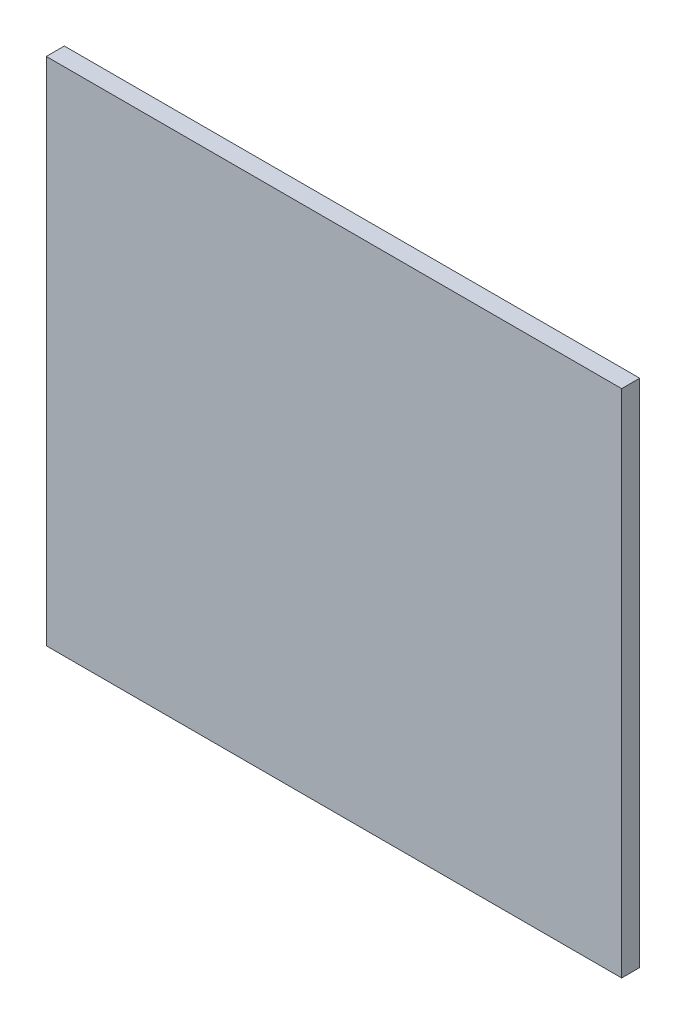
ISO-10303-21;
HEADER;
FILE_DESCRIPTION(('STEP AP214'),'2;1');
FILE_NAME('part.step','',(''),(''),'','','');
FILE_SCHEMA(('AUTOMOTIVE_DESIGN { 1 0 10303 214 1 1 1 1 }'));
ENDSEC;
DATA;
#1=APPLICATION_CONTEXT('core data for automotive mechanical design processes');
#2=APPLICATION_PROTOCOL_DEFINITION('international standard','automotive_design',2000,#1);
#3=PRODUCT_CONTEXT('',#1,'mechanical');
#4=PRODUCT('Part','Part','',(#3));
#5=PRODUCT_RELATED_PRODUCT_CATEGORY('part','',(#4));
#6=PRODUCT_DEFINITION_FORMATION('','',#4);
#7=PRODUCT_DEFINITION_CONTEXT('part definition',#1,'design');
#8=PRODUCT_DEFINITION('design','',#6,#7);
#9=PRODUCT_DEFINITION_SHAPE('','',#8);
#10=(LENGTH_UNIT() NAMED_UNIT(*) SI_UNIT(.MILLI.,.METRE.));
#11=(NAMED_UNIT(*) PLANE_ANGLE_UNIT() SI_UNIT($,.RADIAN.));
#12=(NAMED_UNIT(*) SI_UNIT($,.STERADIAN.) SOLID_ANGLE_UNIT());
#13=UNCERTAINTY_MEASURE_WITH_UNIT(LENGTH_MEASURE(1.E-05),#10,'distance_accuracy_value','');
#14=(GEOMETRIC_REPRESENTATION_CONTEXT(3) GLOBAL_UNCERTAINTY_ASSIGNED_CONTEXT((#13)) GLOBAL_UNIT_ASSIGNED_CONTEXT((#10,
#11,#12)) REPRESENTATION_CONTEXT('',''));
#15=CARTESIAN_POINT('',(0.,0.,0.));
#16=DIRECTION('',(0.,0.,1.));
#17=DIRECTION('',(1.,0.,0.));
#18=AXIS2_PLACEMENT_3D('',#15,#16,#17);
#19=CARTESIAN_POINT('',(-400.,-1.77635683940025E-12,-12.5));
#20=DIRECTION('',(-1.,0.,0.));
#21=DIRECTION('',(0.,-1.,0.));
#22=AXIS2_PLACEMENT_3D('',#19,#20,#21);
#23=PLANE('',#22);
#24=DIRECTION('',(0.,-1.,0.));
#25=VECTOR('',#24,1.);
#26=CARTESIAN_POINT('',(-400.,-1.77635683940025E-12,0.));
#27=LINE('',#26,#25);
#28=CARTESIAN_POINT('',(-400.,-1.77635683940025E-12,0.));
#29=VERTEX_POINT('',#28);
#30=CARTESIAN_POINT('',(-400.,-353.5,0.));
#31=VERTEX_POINT('',#30);
#32=EDGE_CURVE('E99',#29,#31,#27,.T.);
#33=ORIENTED_EDGE('',*,*,#32,.F.);
#34=DIRECTION('',(0.,0.,1.));
#35=VECTOR('',#34,1.);
#36=CARTESIAN_POINT('',(-400.,-1.77635683940025E-12,-12.5));
#37=LINE('',#36,#35);
#38=CARTESIAN_POINT('',(-400.,-1.77635683940025E-12,-12.5));
#39=VERTEX_POINT('',#38);
#40=EDGE_CURVE('E11',#39,#29,#37,.T.);
#41=ORIENTED_EDGE('',*,*,#40,.F.);
#42=DIRECTION('',(0.,-1.,0.));
#43=VECTOR('',#42,1.);
#44=CARTESIAN_POINT('',(-400.,-1.77635683940025E-12,-12.5));
#45=LINE('',#44,#43);
#46=CARTESIAN_POINT('',(-400.,-353.5,-12.5));
#47=VERTEX_POINT('',#46);
#48=EDGE_CURVE('E93',#39,#47,#45,.T.);
#49=ORIENTED_EDGE('',*,*,#48,.T.);
#50=DIRECTION('',(0.,0.,1.));
#51=VECTOR('',#50,1.);
#52=CARTESIAN_POINT('',(-400.,-353.5,-12.5));
#53=LINE('',#52,#51);
#54=EDGE_CURVE('E38',#47,#31,#53,.T.);
#55=ORIENTED_EDGE('',*,*,#54,.T.);
#56=EDGE_LOOP('',(#33,#41,#49,#55));
#57=FACE_BOUND('',#56,.T.);
#58=ADVANCED_FACE('F35',(#57),#23,.T.);
#59=CARTESIAN_POINT('',(-400.,-1.77635683940025E-12,-12.5));
#60=DIRECTION('',(0.,1.,0.));
#61=DIRECTION('',(-1.,0.,0.));
#62=AXIS2_PLACEMENT_3D('',#59,#60,#61);
#63=PLANE('',#62);
#64=DIRECTION('',(-1.,0.,0.));
#65=VECTOR('',#64,1.);
#66=CARTESIAN_POINT('',(-400.,-1.77635683940025E-12,0.));
#67=LINE('',#66,#65);
#68=CARTESIAN_POINT('',(-1.49999999999961,0.,0.));
#69=VERTEX_POINT('',#68);
#70=EDGE_CURVE('E95',#69,#29,#67,.T.);
#71=ORIENTED_EDGE('',*,*,#70,.F.);
#72=DIRECTION('',(0.,0.,1.));
#73=VECTOR('',#72,1.);
#74=CARTESIAN_POINT('',(-1.49999999999961,0.,-12.5));
#75=LINE('',#74,#73);
#76=CARTESIAN_POINT('',(-1.49999999999961,0.,-12.5));
#77=VERTEX_POINT('',#76);
#78=EDGE_CURVE('E44',#77,#69,#75,.T.);
#79=ORIENTED_EDGE('',*,*,#78,.F.);
#80=DIRECTION('',(-1.,0.,0.));
#81=VECTOR('',#80,1.);
#82=CARTESIAN_POINT('',(-400.,-1.77635683940025E-12,-12.5));
#83=LINE('',#82,#81);
#84=EDGE_CURVE('E90',#77,#39,#83,.T.);
#85=ORIENTED_EDGE('',*,*,#84,.T.);
#86=ORIENTED_EDGE('',*,*,#40,.T.);
#87=EDGE_LOOP('',(#71,#79,#85,#86));
#88=FACE_BOUND('',#87,.T.);
#89=ADVANCED_FACE('F109',(#88),#63,.T.);
#90=CARTESIAN_POINT('',(-1.49999999999961,0.,-12.5));
#91=DIRECTION('',(1.,0.,0.));
#92=DIRECTION('',(0.,1.,0.));
#93=AXIS2_PLACEMENT_3D('',#90,#91,#92);
#94=PLANE('',#93);
#95=DIRECTION('',(0.,1.,0.));
#96=VECTOR('',#95,1.);
#97=CARTESIAN_POINT('',(-1.49999999999961,0.,0.));
#98=LINE('',#97,#96);
#99=CARTESIAN_POINT('',(-1.49999999999959,-353.5,0.));
#100=VERTEX_POINT('',#99);
#101=EDGE_CURVE('E85',#100,#69,#98,.T.);
#102=ORIENTED_EDGE('',*,*,#101,.F.);
#103=DIRECTION('',(0.,0.,1.));
#104=VECTOR('',#103,1.);
#105=CARTESIAN_POINT('',(-1.49999999999959,-353.5,-12.5));
#106=LINE('',#105,#104);
#107=CARTESIAN_POINT('',(-1.49999999999959,-353.5,-12.5));
#108=VERTEX_POINT('',#107);
#109=EDGE_CURVE('E80',#108,#100,#106,.T.);
#110=ORIENTED_EDGE('',*,*,#109,.F.);
#111=DIRECTION('',(0.,1.,0.));
#112=VECTOR('',#111,1.);
#113=CARTESIAN_POINT('',(-1.49999999999961,0.,-12.5));
#114=LINE('',#113,#112);
#115=EDGE_CURVE('E83',#108,#77,#114,.T.);
#116=ORIENTED_EDGE('',*,*,#115,.T.);
#117=ORIENTED_EDGE('',*,*,#78,.T.);
#118=EDGE_LOOP('',(#102,#110,#116,#117));
#119=FACE_BOUND('',#118,.T.);
#120=ADVANCED_FACE('F82',(#119),#94,.T.);
#121=CARTESIAN_POINT('',(-400.,-353.5,-12.5));
#122=DIRECTION('',(0.,-1.,0.));
#123=DIRECTION('',(0.,0.,-1.));
#124=AXIS2_PLACEMENT_3D('',#121,#122,#123);
#125=PLANE('',#124);
#126=DIRECTION('',(1.,0.,0.));
#127=VECTOR('',#126,1.);
#128=CARTESIAN_POINT('',(-400.,-353.5,0.));
#129=LINE('',#128,#127);
#130=EDGE_CURVE('E102',#31,#100,#129,.T.);
#131=ORIENTED_EDGE('',*,*,#130,.F.);
#132=ORIENTED_EDGE('',*,*,#54,.F.);
#133=DIRECTION('',(1.,0.,0.));
#134=VECTOR('',#133,1.);
#135=CARTESIAN_POINT('',(-400.,-353.5,-12.5));
#136=LINE('',#135,#134);
#137=EDGE_CURVE('E89',#47,#108,#136,.T.);
#138=ORIENTED_EDGE('',*,*,#137,.T.);
#139=ORIENTED_EDGE('',*,*,#109,.T.);
#140=EDGE_LOOP('',(#131,#132,#138,#139));
#141=FACE_BOUND('',#140,.T.);
#142=ADVANCED_FACE('F92',(#141),#125,.T.);
#143=CARTESIAN_POINT('',(0.,0.,-12.5));
#144=DIRECTION('',(0.,0.,1.));
#145=DIRECTION('',(1.,0.,0.));
#146=AXIS2_PLACEMENT_3D('',#143,#144,#145);
#147=PLANE('',#146);
#148=ORIENTED_EDGE('',*,*,#48,.F.);
#149=ORIENTED_EDGE('',*,*,#84,.F.);
#150=ORIENTED_EDGE('',*,*,#115,.F.);
#151=ORIENTED_EDGE('',*,*,#137,.F.);
#152=EDGE_LOOP('',(#148,#149,#150,#151));
#153=FACE_BOUND('',#152,.T.);
#154=ADVANCED_FACE('F88',(#153),#147,.F.);
#155=CARTESIAN_POINT('',(0.,0.,0.));
#156=DIRECTION('',(0.,0.,1.));
#157=DIRECTION('',(1.,0.,0.));
#158=AXIS2_PLACEMENT_3D('',#155,#156,#157);
#159=PLANE('',#158);
#160=ORIENTED_EDGE('',*,*,#32,.T.);
#161=ORIENTED_EDGE('',*,*,#130,.T.);
#162=ORIENTED_EDGE('',*,*,#101,.T.);
#163=ORIENTED_EDGE('',*,*,#70,.T.);
#164=EDGE_LOOP('',(#160,#161,#162,#163));
#165=FACE_BOUND('',#164,.T.);
#166=ADVANCED_FACE('F108',(#165),#159,.T.);
#167=CLOSED_SHELL('',(#58,#89,#120,#142,#154,#166));
#168=MANIFOLD_SOLID_BREP('B2',#167);
#169=ADVANCED_BREP_SHAPE_REPRESENTATION('',(#18,#168),#14);
#170=SHAPE_DEFINITION_REPRESENTATION(#9,#169);
ENDSEC;
END-ISO-10303-21;
